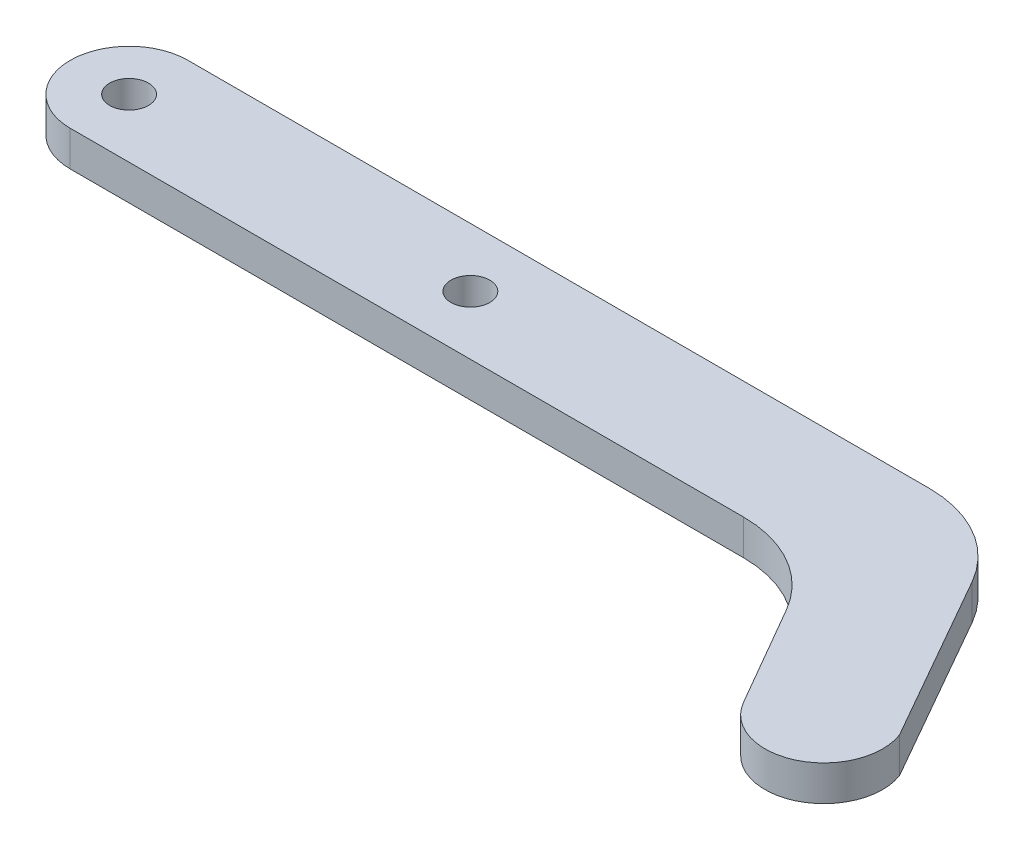
ISO-10303-21;
HEADER;
FILE_DESCRIPTION(('STEP AP214'),'2;1');
FILE_NAME('part.step','',(''),(''),'','','');
FILE_SCHEMA(('AUTOMOTIVE_DESIGN { 1 0 10303 214 1 1 1 1 }'));
ENDSEC;
DATA;
#1=APPLICATION_CONTEXT('core data for automotive mechanical design processes');
#2=APPLICATION_PROTOCOL_DEFINITION('international standard','automotive_design',2000,#1);
#3=PRODUCT_CONTEXT('',#1,'mechanical');
#4=PRODUCT('Part','Part','',(#3));
#5=PRODUCT_RELATED_PRODUCT_CATEGORY('part','',(#4));
#6=PRODUCT_DEFINITION_FORMATION('','',#4);
#7=PRODUCT_DEFINITION_CONTEXT('part definition',#1,'design');
#8=PRODUCT_DEFINITION('design','',#6,#7);
#9=PRODUCT_DEFINITION_SHAPE('','',#8);
#10=(LENGTH_UNIT() NAMED_UNIT(*) SI_UNIT(.MILLI.,.METRE.));
#11=(NAMED_UNIT(*) PLANE_ANGLE_UNIT() SI_UNIT($,.RADIAN.));
#12=(NAMED_UNIT(*) SI_UNIT($,.STERADIAN.) SOLID_ANGLE_UNIT());
#13=UNCERTAINTY_MEASURE_WITH_UNIT(LENGTH_MEASURE(1.E-05),#10,'distance_accuracy_value','');
#14=(GEOMETRIC_REPRESENTATION_CONTEXT(3) GLOBAL_UNCERTAINTY_ASSIGNED_CONTEXT((#13)) GLOBAL_UNIT_ASSIGNED_CONTEXT((#10,
#11,#12)) REPRESENTATION_CONTEXT('',''));
#15=CARTESIAN_POINT('',(0.,0.,0.));
#16=DIRECTION('',(0.,0.,1.));
#17=DIRECTION('',(1.,0.,0.));
#18=AXIS2_PLACEMENT_3D('',#15,#16,#17);
#19=CARTESIAN_POINT('',(0.,3.,-5.));
#20=DIRECTION('',(0.,-1.,0.));
#21=DIRECTION('',(0.,0.,-1.));
#22=AXIS2_PLACEMENT_3D('',#19,#20,#21);
#23=PLANE('',#22);
#24=CARTESIAN_POINT('',(0.,3.,-5.));
#25=DIRECTION('',(0.,1.,0.));
#26=DIRECTION('',(0.,0.,-1.));
#27=AXIS2_PLACEMENT_3D('',#24,#25,#26);
#28=CIRCLE('',#27,5.);
#29=CARTESIAN_POINT('',(0.,3.,-10.));
#30=VERTEX_POINT('',#29);
#31=CARTESIAN_POINT('',(0.,3.,0.));
#32=VERTEX_POINT('',#31);
#33=EDGE_CURVE('E147',#30,#32,#28,.T.);
#34=ORIENTED_EDGE('',*,*,#33,.T.);
#35=DIRECTION('',(1.,0.,0.));
#36=VECTOR('',#35,1.);
#37=CARTESIAN_POINT('',(0.,3.,0.));
#38=LINE('',#37,#36);
#39=CARTESIAN_POINT('',(57.2,3.,0.));
#40=VERTEX_POINT('',#39);
#41=EDGE_CURVE('E95',#32,#40,#38,.T.);
#42=ORIENTED_EDGE('',*,*,#41,.T.);
#43=CARTESIAN_POINT('',(57.2,3.,10.));
#44=DIRECTION('',(0.,-1.,0.));
#45=DIRECTION('',(0.,0.,-1.));
#46=AXIS2_PLACEMENT_3D('',#43,#44,#45);
#47=CIRCLE('',#46,10.);
#48=CARTESIAN_POINT('',(65.8602540378444,3.,5.));
#49=VERTEX_POINT('',#48);
#50=EDGE_CURVE('E162',#40,#49,#47,.T.);
#51=ORIENTED_EDGE('',*,*,#50,.T.);
#52=DIRECTION('',(0.500000000000001,0.,0.866025403784438));
#53=VECTOR('',#52,1.);
#54=CARTESIAN_POINT('',(65.8602540378444,3.,5.));
#55=LINE('',#54,#53);
#56=CARTESIAN_POINT('',(70.8560510382858,3.,13.6529742290647));
#57=VERTEX_POINT('',#56);
#58=EDGE_CURVE('E175',#49,#57,#55,.T.);
#59=ORIENTED_EDGE('',*,*,#58,.T.);
#60=CARTESIAN_POINT('',(75.186178057208,3.,11.1529742290646));
#61=DIRECTION('',(0.,1.,0.));
#62=DIRECTION('',(0.,0.,1.));
#63=AXIS2_PLACEMENT_3D('',#60,#61,#62);
#64=CIRCLE('',#63,5.);
#65=CARTESIAN_POINT('',(79.8706823405444,3.,9.40499836555784));
#66=VERTEX_POINT('',#65);
#67=EDGE_CURVE('E114',#57,#66,#64,.T.);
#68=ORIENTED_EDGE('',*,*,#67,.T.);
#69=DIRECTION('',(-0.495175786181502,0.,-0.868792806588275));
#70=VECTOR('',#69,1.);
#71=CARTESIAN_POINT('',(79.8706823405444,3.,9.40499836555784));
#72=LINE('',#71,#70);
#73=CARTESIAN_POINT('',(71.6879280658827,3.,-4.951757861815));
#74=VERTEX_POINT('',#73);
#75=EDGE_CURVE('E108',#66,#74,#72,.T.);
#76=ORIENTED_EDGE('',*,*,#75,.T.);
#77=CARTESIAN_POINT('',(63.,3.,0.));
#78=DIRECTION('',(0.,1.,0.));
#79=DIRECTION('',(0.,0.,1.));
#80=AXIS2_PLACEMENT_3D('',#77,#78,#79);
#81=CIRCLE('',#80,9.99999999999999);
#82=CARTESIAN_POINT('',(63.,3.,-9.99999999999999));
#83=VERTEX_POINT('',#82);
#84=EDGE_CURVE('E112',#74,#83,#81,.T.);
#85=ORIENTED_EDGE('',*,*,#84,.T.);
#86=DIRECTION('',(-1.,0.,0.));
#87=VECTOR('',#86,1.);
#88=CARTESIAN_POINT('',(0.,3.,-10.));
#89=LINE('',#88,#87);
#90=EDGE_CURVE('E52',#83,#30,#89,.T.);
#91=ORIENTED_EDGE('',*,*,#90,.T.);
#92=EDGE_LOOP('',(#34,#42,#51,#59,#68,#76,#85,#91));
#93=FACE_BOUND('',#92,.T.);
#94=CARTESIAN_POINT('',(0.,3.,-5.));
#95=DIRECTION('',(0.,1.,0.));
#96=DIRECTION('',(0.,0.,1.));
#97=AXIS2_PLACEMENT_3D('',#94,#95,#96);
#98=CIRCLE('',#97,1.65);
#99=CARTESIAN_POINT('',(0.,3.,-3.35));
#100=VERTEX_POINT('',#99);
#101=EDGE_CURVE('E136',#100,#100,#98,.T.);
#102=ORIENTED_EDGE('',*,*,#101,.F.);
#103=EDGE_LOOP('',(#102));
#104=FACE_BOUND('',#103,.T.);
#105=CARTESIAN_POINT('',(29.,3.,-5.));
#106=DIRECTION('',(0.,1.,0.));
#107=DIRECTION('',(0.,0.,1.));
#108=AXIS2_PLACEMENT_3D('',#105,#106,#107);
#109=CIRCLE('',#108,1.65);
#110=CARTESIAN_POINT('',(29.,3.,-3.35));
#111=VERTEX_POINT('',#110);
#112=EDGE_CURVE('E184',#111,#111,#109,.T.);
#113=ORIENTED_EDGE('',*,*,#112,.F.);
#114=EDGE_LOOP('',(#113));
#115=FACE_BOUND('',#114,.T.);
#116=ADVANCED_FACE('F35',(#93,#104,#115),#23,.F.);
#117=CARTESIAN_POINT('',(0.,0.,-5.));
#118=DIRECTION('',(0.,-1.,0.));
#119=DIRECTION('',(0.,0.,-1.));
#120=AXIS2_PLACEMENT_3D('',#117,#118,#119);
#121=PLANE('',#120);
#122=CARTESIAN_POINT('',(0.,0.,-5.));
#123=DIRECTION('',(0.,1.,0.));
#124=DIRECTION('',(0.,0.,1.));
#125=AXIS2_PLACEMENT_3D('',#122,#123,#124);
#126=CIRCLE('',#125,1.65);
#127=CARTESIAN_POINT('',(0.,0.,-3.35));
#128=VERTEX_POINT('',#127);
#129=EDGE_CURVE('E181',#128,#128,#126,.T.);
#130=ORIENTED_EDGE('',*,*,#129,.T.);
#131=EDGE_LOOP('',(#130));
#132=FACE_BOUND('',#131,.T.);
#133=CARTESIAN_POINT('',(0.,0.,-5.));
#134=DIRECTION('',(0.,1.,0.));
#135=DIRECTION('',(0.,0.,-1.));
#136=AXIS2_PLACEMENT_3D('',#133,#134,#135);
#137=CIRCLE('',#136,5.);
#138=CARTESIAN_POINT('',(0.,0.,-10.));
#139=VERTEX_POINT('',#138);
#140=CARTESIAN_POINT('',(0.,0.,0.));
#141=VERTEX_POINT('',#140);
#142=EDGE_CURVE('E132',#139,#141,#137,.T.);
#143=ORIENTED_EDGE('',*,*,#142,.F.);
#144=DIRECTION('',(-1.,0.,0.));
#145=VECTOR('',#144,1.);
#146=CARTESIAN_POINT('',(0.,0.,-10.));
#147=LINE('',#146,#145);
#148=CARTESIAN_POINT('',(63.,0.,-9.99999999999999));
#149=VERTEX_POINT('',#148);
#150=EDGE_CURVE('E87',#149,#139,#147,.T.);
#151=ORIENTED_EDGE('',*,*,#150,.F.);
#152=CARTESIAN_POINT('',(63.,0.,0.));
#153=DIRECTION('',(0.,1.,0.));
#154=DIRECTION('',(0.,0.,1.));
#155=AXIS2_PLACEMENT_3D('',#152,#153,#154);
#156=CIRCLE('',#155,9.99999999999999);
#157=CARTESIAN_POINT('',(71.6879280658827,0.,-4.951757861815));
#158=VERTEX_POINT('',#157);
#159=EDGE_CURVE('E81',#158,#149,#156,.T.);
#160=ORIENTED_EDGE('',*,*,#159,.F.);
#161=DIRECTION('',(-0.495175786181502,0.,-0.868792806588275));
#162=VECTOR('',#161,1.);
#163=CARTESIAN_POINT('',(79.8706823405444,0.,9.40499836555784));
#164=LINE('',#163,#162);
#165=CARTESIAN_POINT('',(79.8706823405444,0.,9.40499836555784));
#166=VERTEX_POINT('',#165);
#167=EDGE_CURVE('E122',#166,#158,#164,.T.);
#168=ORIENTED_EDGE('',*,*,#167,.F.);
#169=CARTESIAN_POINT('',(75.186178057208,0.,11.1529742290646));
#170=DIRECTION('',(0.,1.,0.));
#171=DIRECTION('',(0.,0.,1.));
#172=AXIS2_PLACEMENT_3D('',#169,#170,#171);
#173=CIRCLE('',#172,5.);
#174=CARTESIAN_POINT('',(70.8560510382858,0.,13.6529742290647));
#175=VERTEX_POINT('',#174);
#176=EDGE_CURVE('E142',#175,#166,#173,.T.);
#177=ORIENTED_EDGE('',*,*,#176,.F.);
#178=DIRECTION('',(0.500000000000001,0.,0.866025403784438));
#179=VECTOR('',#178,1.);
#180=CARTESIAN_POINT('',(65.8602540378444,0.,5.));
#181=LINE('',#180,#179);
#182=CARTESIAN_POINT('',(65.8602540378444,0.,5.));
#183=VERTEX_POINT('',#182);
#184=EDGE_CURVE('E140',#183,#175,#181,.T.);
#185=ORIENTED_EDGE('',*,*,#184,.F.);
#186=CARTESIAN_POINT('',(57.2,0.,10.));
#187=DIRECTION('',(0.,-1.,0.));
#188=DIRECTION('',(0.,0.,-1.));
#189=AXIS2_PLACEMENT_3D('',#186,#187,#188);
#190=CIRCLE('',#189,10.);
#191=CARTESIAN_POINT('',(57.2,0.,0.));
#192=VERTEX_POINT('',#191);
#193=EDGE_CURVE('E138',#192,#183,#190,.T.);
#194=ORIENTED_EDGE('',*,*,#193,.F.);
#195=DIRECTION('',(1.,0.,0.));
#196=VECTOR('',#195,1.);
#197=CARTESIAN_POINT('',(0.,0.,0.));
#198=LINE('',#197,#196);
#199=EDGE_CURVE('E135',#141,#192,#198,.T.);
#200=ORIENTED_EDGE('',*,*,#199,.F.);
#201=EDGE_LOOP('',(#143,#151,#160,#168,#177,#185,#194,#200));
#202=FACE_BOUND('',#201,.T.);
#203=CARTESIAN_POINT('',(29.,0.,-5.));
#204=DIRECTION('',(0.,1.,0.));
#205=DIRECTION('',(0.,0.,1.));
#206=AXIS2_PLACEMENT_3D('',#203,#204,#205);
#207=CIRCLE('',#206,1.65);
#208=CARTESIAN_POINT('',(29.,0.,-3.35));
#209=VERTEX_POINT('',#208);
#210=EDGE_CURVE('E187',#209,#209,#207,.T.);
#211=ORIENTED_EDGE('',*,*,#210,.T.);
#212=EDGE_LOOP('',(#211));
#213=FACE_BOUND('',#212,.T.);
#214=ADVANCED_FACE('F166',(#132,#202,#213),#121,.T.);
#215=CARTESIAN_POINT('',(0.,3.,-5.));
#216=DIRECTION('',(0.,-1.,0.));
#217=DIRECTION('',(0.,0.,-1.));
#218=AXIS2_PLACEMENT_3D('',#215,#216,#217);
#219=CYLINDRICAL_SURFACE('',#218,5.);
#220=ORIENTED_EDGE('',*,*,#142,.T.);
#221=DIRECTION('',(0.,-1.,0.));
#222=VECTOR('',#221,1.);
#223=CARTESIAN_POINT('',(0.,3.,0.));
#224=LINE('',#223,#222);
#225=EDGE_CURVE('E11',#32,#141,#224,.T.);
#226=ORIENTED_EDGE('',*,*,#225,.F.);
#227=ORIENTED_EDGE('',*,*,#33,.F.);
#228=DIRECTION('',(0.,-1.,0.));
#229=VECTOR('',#228,1.);
#230=CARTESIAN_POINT('',(0.,3.,-10.));
#231=LINE('',#230,#229);
#232=EDGE_CURVE('E128',#30,#139,#231,.T.);
#233=ORIENTED_EDGE('',*,*,#232,.T.);
#234=EDGE_LOOP('',(#220,#226,#227,#233));
#235=FACE_BOUND('',#234,.T.);
#236=ADVANCED_FACE('F37',(#235),#219,.T.);
#237=CARTESIAN_POINT('',(0.,3.,0.));
#238=DIRECTION('',(0.,0.,-1.));
#239=DIRECTION('',(-1.,0.,0.));
#240=AXIS2_PLACEMENT_3D('',#237,#238,#239);
#241=PLANE('',#240);
#242=ORIENTED_EDGE('',*,*,#199,.T.);
#243=DIRECTION('',(0.,-1.,0.));
#244=VECTOR('',#243,1.);
#245=CARTESIAN_POINT('',(57.2,3.,0.));
#246=LINE('',#245,#244);
#247=EDGE_CURVE('E44',#40,#192,#246,.T.);
#248=ORIENTED_EDGE('',*,*,#247,.F.);
#249=ORIENTED_EDGE('',*,*,#41,.F.);
#250=ORIENTED_EDGE('',*,*,#225,.T.);
#251=EDGE_LOOP('',(#242,#248,#249,#250));
#252=FACE_BOUND('',#251,.T.);
#253=ADVANCED_FACE('F219',(#252),#241,.F.);
#254=CARTESIAN_POINT('',(57.2,3.,10.));
#255=DIRECTION('',(0.,-1.,0.));
#256=DIRECTION('',(0.,0.,-1.));
#257=AXIS2_PLACEMENT_3D('',#254,#255,#256);
#258=CYLINDRICAL_SURFACE('',#257,10.);
#259=ORIENTED_EDGE('',*,*,#193,.T.);
#260=DIRECTION('',(0.,-1.,0.));
#261=VECTOR('',#260,1.);
#262=CARTESIAN_POINT('',(65.8602540378444,3.,5.));
#263=LINE('',#262,#261);
#264=EDGE_CURVE('E154',#49,#183,#263,.T.);
#265=ORIENTED_EDGE('',*,*,#264,.F.);
#266=ORIENTED_EDGE('',*,*,#50,.F.);
#267=ORIENTED_EDGE('',*,*,#247,.T.);
#268=EDGE_LOOP('',(#259,#265,#266,#267));
#269=FACE_BOUND('',#268,.T.);
#270=ADVANCED_FACE('F160',(#269),#258,.F.);
#271=CARTESIAN_POINT('',(65.8602540378444,3.,5.));
#272=DIRECTION('',(0.866025403784438,0.,-0.5));
#273=DIRECTION('',(-0.500000000000001,0.,-0.866025403784438));
#274=AXIS2_PLACEMENT_3D('',#271,#272,#273);
#275=PLANE('',#274);
#276=ORIENTED_EDGE('',*,*,#184,.T.);
#277=DIRECTION('',(0.,-1.,0.));
#278=VECTOR('',#277,1.);
#279=CARTESIAN_POINT('',(70.8560510382858,3.,13.6529742290647));
#280=LINE('',#279,#278);
#281=EDGE_CURVE('E151',#57,#175,#280,.T.);
#282=ORIENTED_EDGE('',*,*,#281,.F.);
#283=ORIENTED_EDGE('',*,*,#58,.F.);
#284=ORIENTED_EDGE('',*,*,#264,.T.);
#285=EDGE_LOOP('',(#276,#282,#283,#284));
#286=FACE_BOUND('',#285,.T.);
#287=ADVANCED_FACE('F171',(#286),#275,.F.);
#288=CARTESIAN_POINT('',(75.186178057208,3.,11.1529742290646));
#289=DIRECTION('',(0.,-1.,0.));
#290=DIRECTION('',(0.,0.,-1.));
#291=AXIS2_PLACEMENT_3D('',#288,#289,#290);
#292=CYLINDRICAL_SURFACE('',#291,5.);
#293=ORIENTED_EDGE('',*,*,#176,.T.);
#294=DIRECTION('',(0.,-1.,0.));
#295=VECTOR('',#294,1.);
#296=CARTESIAN_POINT('',(79.8706823405444,3.,9.40499836555784));
#297=LINE('',#296,#295);
#298=EDGE_CURVE('E123',#66,#166,#297,.T.);
#299=ORIENTED_EDGE('',*,*,#298,.F.);
#300=ORIENTED_EDGE('',*,*,#67,.F.);
#301=ORIENTED_EDGE('',*,*,#281,.T.);
#302=EDGE_LOOP('',(#293,#299,#300,#301));
#303=FACE_BOUND('',#302,.T.);
#304=ADVANCED_FACE('F174',(#303),#292,.T.);
#305=CARTESIAN_POINT('',(79.8706823405444,3.,9.40499836555784));
#306=DIRECTION('',(-0.868792806588275,0.,0.495175786181502));
#307=DIRECTION('',(0.495175786181502,0.,0.868792806588275));
#308=AXIS2_PLACEMENT_3D('',#305,#306,#307);
#309=PLANE('',#308);
#310=ORIENTED_EDGE('',*,*,#167,.T.);
#311=DIRECTION('',(0.,-1.,0.));
#312=VECTOR('',#311,1.);
#313=CARTESIAN_POINT('',(71.6879280658827,3.,-4.951757861815));
#314=LINE('',#313,#312);
#315=EDGE_CURVE('E119',#74,#158,#314,.T.);
#316=ORIENTED_EDGE('',*,*,#315,.F.);
#317=ORIENTED_EDGE('',*,*,#75,.F.);
#318=ORIENTED_EDGE('',*,*,#298,.T.);
#319=EDGE_LOOP('',(#310,#316,#317,#318));
#320=FACE_BOUND('',#319,.T.);
#321=ADVANCED_FACE('F120',(#320),#309,.F.);
#322=CARTESIAN_POINT('',(63.,3.,0.));
#323=DIRECTION('',(0.,-1.,0.));
#324=DIRECTION('',(0.,0.,-1.));
#325=AXIS2_PLACEMENT_3D('',#322,#323,#324);
#326=CYLINDRICAL_SURFACE('',#325,9.99999999999999);
#327=ORIENTED_EDGE('',*,*,#159,.T.);
#328=DIRECTION('',(0.,-1.,0.));
#329=VECTOR('',#328,1.);
#330=CARTESIAN_POINT('',(63.,3.,-9.99999999999999));
#331=LINE('',#330,#329);
#332=EDGE_CURVE('E124',#83,#149,#331,.T.);
#333=ORIENTED_EDGE('',*,*,#332,.F.);
#334=ORIENTED_EDGE('',*,*,#84,.F.);
#335=ORIENTED_EDGE('',*,*,#315,.T.);
#336=EDGE_LOOP('',(#327,#333,#334,#335));
#337=FACE_BOUND('',#336,.T.);
#338=ADVANCED_FACE('F126',(#337),#326,.T.);
#339=CARTESIAN_POINT('',(0.,3.,-10.));
#340=DIRECTION('',(0.,0.,1.));
#341=DIRECTION('',(1.,0.,0.));
#342=AXIS2_PLACEMENT_3D('',#339,#340,#341);
#343=PLANE('',#342);
#344=ORIENTED_EDGE('',*,*,#150,.T.);
#345=ORIENTED_EDGE('',*,*,#232,.F.);
#346=ORIENTED_EDGE('',*,*,#90,.F.);
#347=ORIENTED_EDGE('',*,*,#332,.T.);
#348=EDGE_LOOP('',(#344,#345,#346,#347));
#349=FACE_BOUND('',#348,.T.);
#350=ADVANCED_FACE('F207',(#349),#343,.F.);
#351=CARTESIAN_POINT('',(0.,3.,-5.));
#352=DIRECTION('',(0.,-1.,0.));
#353=DIRECTION('',(0.,0.,-1.));
#354=AXIS2_PLACEMENT_3D('',#351,#352,#353);
#355=CYLINDRICAL_SURFACE('',#354,1.65);
#356=ORIENTED_EDGE('',*,*,#101,.T.);
#357=EDGE_LOOP('',(#356));
#358=FACE_BOUND('',#357,.T.);
#359=ORIENTED_EDGE('',*,*,#129,.F.);
#360=EDGE_LOOP('',(#359));
#361=FACE_BOUND('',#360,.T.);
#362=ADVANCED_FACE('F204',(#358,#361),#355,.F.);
#363=CARTESIAN_POINT('',(29.,3.,-5.));
#364=DIRECTION('',(0.,-1.,0.));
#365=DIRECTION('',(0.,0.,-1.));
#366=AXIS2_PLACEMENT_3D('',#363,#364,#365);
#367=CYLINDRICAL_SURFACE('',#366,1.65);
#368=ORIENTED_EDGE('',*,*,#112,.T.);
#369=EDGE_LOOP('',(#368));
#370=FACE_BOUND('',#369,.T.);
#371=ORIENTED_EDGE('',*,*,#210,.F.);
#372=EDGE_LOOP('',(#371));
#373=FACE_BOUND('',#372,.T.);
#374=ADVANCED_FACE('F193',(#370,#373),#367,.F.);
#375=CLOSED_SHELL('',(#116,#214,#236,#253,#270,#287,#304,#321,#338,#350,#362,#374));
#376=MANIFOLD_SOLID_BREP('B2',#375);
#377=ADVANCED_BREP_SHAPE_REPRESENTATION('',(#18,#376),#14);
#378=SHAPE_DEFINITION_REPRESENTATION(#9,#377);
ENDSEC;
END-ISO-10303-21;
